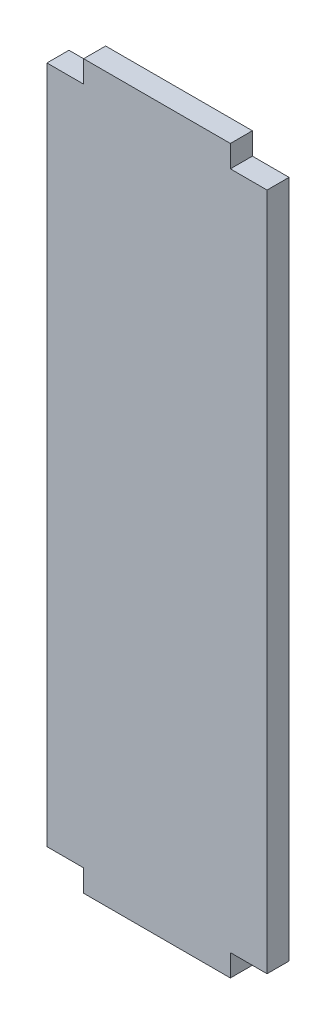
ISO-10303-21;
HEADER;
FILE_DESCRIPTION(('STEP AP214'),'2;1');
FILE_NAME('part.step','',(''),(''),'','','');
FILE_SCHEMA(('AUTOMOTIVE_DESIGN { 1 0 10303 214 1 1 1 1 }'));
ENDSEC;
DATA;
#1=APPLICATION_CONTEXT('core data for automotive mechanical design processes');
#2=APPLICATION_PROTOCOL_DEFINITION('international standard','automotive_design',2000,#1);
#3=PRODUCT_CONTEXT('',#1,'mechanical');
#4=PRODUCT('Part','Part','',(#3));
#5=PRODUCT_RELATED_PRODUCT_CATEGORY('part','',(#4));
#6=PRODUCT_DEFINITION_FORMATION('','',#4);
#7=PRODUCT_DEFINITION_CONTEXT('part definition',#1,'design');
#8=PRODUCT_DEFINITION('design','',#6,#7);
#9=PRODUCT_DEFINITION_SHAPE('','',#8);
#10=(LENGTH_UNIT() NAMED_UNIT(*) SI_UNIT(.MILLI.,.METRE.));
#11=(NAMED_UNIT(*) PLANE_ANGLE_UNIT() SI_UNIT($,.RADIAN.));
#12=(NAMED_UNIT(*) SI_UNIT($,.STERADIAN.) SOLID_ANGLE_UNIT());
#13=UNCERTAINTY_MEASURE_WITH_UNIT(LENGTH_MEASURE(1.E-05),#10,'distance_accuracy_value','');
#14=(GEOMETRIC_REPRESENTATION_CONTEXT(3) GLOBAL_UNCERTAINTY_ASSIGNED_CONTEXT((#13)) GLOBAL_UNIT_ASSIGNED_CONTEXT((#10,
#11,#12)) REPRESENTATION_CONTEXT('',''));
#15=CARTESIAN_POINT('',(0.,0.,0.));
#16=DIRECTION('',(0.,0.,1.));
#17=DIRECTION('',(1.,0.,0.));
#18=AXIS2_PLACEMENT_3D('',#15,#16,#17);
#19=CARTESIAN_POINT('',(-20.,92.5,6.));
#20=DIRECTION('',(0.,-1.,0.));
#21=DIRECTION('',(0.,0.,-1.));
#22=AXIS2_PLACEMENT_3D('',#19,#20,#21);
#23=PLANE('',#22);
#24=DIRECTION('',(-1.,0.,0.));
#25=VECTOR('',#24,1.);
#26=CARTESIAN_POINT('',(-20.,92.5,0.));
#27=LINE('',#26,#25);
#28=CARTESIAN_POINT('',(-20.,92.5,0.));
#29=VERTEX_POINT('',#28);
#30=CARTESIAN_POINT('',(-30.,92.5,0.));
#31=VERTEX_POINT('',#30);
#32=EDGE_CURVE('E153',#29,#31,#27,.T.);
#33=ORIENTED_EDGE('',*,*,#32,.T.);
#34=DIRECTION('',(0.,0.,-1.));
#35=VECTOR('',#34,1.);
#36=CARTESIAN_POINT('',(-30.,92.5,6.));
#37=LINE('',#36,#35);
#38=CARTESIAN_POINT('',(-30.,92.5,6.));
#39=VERTEX_POINT('',#38);
#40=EDGE_CURVE('E11',#39,#31,#37,.T.);
#41=ORIENTED_EDGE('',*,*,#40,.F.);
#42=DIRECTION('',(-1.,0.,0.));
#43=VECTOR('',#42,1.);
#44=CARTESIAN_POINT('',(-20.,92.5,6.));
#45=LINE('',#44,#43);
#46=CARTESIAN_POINT('',(-20.,92.5,6.));
#47=VERTEX_POINT('',#46);
#48=EDGE_CURVE('E175',#47,#39,#45,.T.);
#49=ORIENTED_EDGE('',*,*,#48,.F.);
#50=DIRECTION('',(0.,0.,-1.));
#51=VECTOR('',#50,1.);
#52=CARTESIAN_POINT('',(-20.,92.5,6.));
#53=LINE('',#52,#51);
#54=EDGE_CURVE('E149',#47,#29,#53,.T.);
#55=ORIENTED_EDGE('',*,*,#54,.T.);
#56=EDGE_LOOP('',(#33,#41,#49,#55));
#57=FACE_BOUND('',#56,.T.);
#58=ADVANCED_FACE('F33',(#57),#23,.F.);
#59=CARTESIAN_POINT('',(-30.,92.5,6.));
#60=DIRECTION('',(1.,0.,0.));
#61=DIRECTION('',(0.,0.,-1.));
#62=AXIS2_PLACEMENT_3D('',#59,#60,#61);
#63=PLANE('',#62);
#64=DIRECTION('',(0.,-1.,0.));
#65=VECTOR('',#64,1.);
#66=CARTESIAN_POINT('',(-30.,92.5,0.));
#67=LINE('',#66,#65);
#68=CARTESIAN_POINT('',(-30.,-92.5,0.));
#69=VERTEX_POINT('',#68);
#70=EDGE_CURVE('E156',#31,#69,#67,.T.);
#71=ORIENTED_EDGE('',*,*,#70,.T.);
#72=DIRECTION('',(0.,0.,-1.));
#73=VECTOR('',#72,1.);
#74=CARTESIAN_POINT('',(-30.,-92.5,6.));
#75=LINE('',#74,#73);
#76=CARTESIAN_POINT('',(-30.,-92.5,6.));
#77=VERTEX_POINT('',#76);
#78=EDGE_CURVE('E41',#77,#69,#75,.T.);
#79=ORIENTED_EDGE('',*,*,#78,.F.);
#80=DIRECTION('',(0.,-1.,0.));
#81=VECTOR('',#80,1.);
#82=CARTESIAN_POINT('',(-30.,92.5,6.));
#83=LINE('',#82,#81);
#84=EDGE_CURVE('E104',#39,#77,#83,.T.);
#85=ORIENTED_EDGE('',*,*,#84,.F.);
#86=ORIENTED_EDGE('',*,*,#40,.T.);
#87=EDGE_LOOP('',(#71,#79,#85,#86));
#88=FACE_BOUND('',#87,.T.);
#89=ADVANCED_FACE('F253',(#88),#63,.F.);
#90=CARTESIAN_POINT('',(-30.,-92.5,6.));
#91=DIRECTION('',(0.,1.,0.));
#92=DIRECTION('',(0.,0.,1.));
#93=AXIS2_PLACEMENT_3D('',#90,#91,#92);
#94=PLANE('',#93);
#95=DIRECTION('',(1.,0.,0.));
#96=VECTOR('',#95,1.);
#97=CARTESIAN_POINT('',(-30.,-92.5,0.));
#98=LINE('',#97,#96);
#99=CARTESIAN_POINT('',(-20.,-92.5,0.));
#100=VERTEX_POINT('',#99);
#101=EDGE_CURVE('E158',#69,#100,#98,.T.);
#102=ORIENTED_EDGE('',*,*,#101,.T.);
#103=DIRECTION('',(0.,0.,-1.));
#104=VECTOR('',#103,1.);
#105=CARTESIAN_POINT('',(-20.,-92.5,6.));
#106=LINE('',#105,#104);
#107=CARTESIAN_POINT('',(-20.,-92.5,6.));
#108=VERTEX_POINT('',#107);
#109=EDGE_CURVE('E194',#108,#100,#106,.T.);
#110=ORIENTED_EDGE('',*,*,#109,.F.);
#111=DIRECTION('',(1.,0.,0.));
#112=VECTOR('',#111,1.);
#113=CARTESIAN_POINT('',(-30.,-92.5,6.));
#114=LINE('',#113,#112);
#115=EDGE_CURVE('E202',#77,#108,#114,.T.);
#116=ORIENTED_EDGE('',*,*,#115,.F.);
#117=ORIENTED_EDGE('',*,*,#78,.T.);
#118=EDGE_LOOP('',(#102,#110,#116,#117));
#119=FACE_BOUND('',#118,.T.);
#120=ADVANCED_FACE('F200',(#119),#94,.F.);
#121=CARTESIAN_POINT('',(-20.,-92.5,6.));
#122=DIRECTION('',(1.,0.,0.));
#123=DIRECTION('',(0.,0.,-1.));
#124=AXIS2_PLACEMENT_3D('',#121,#122,#123);
#125=PLANE('',#124);
#126=DIRECTION('',(0.,-1.,0.));
#127=VECTOR('',#126,1.);
#128=CARTESIAN_POINT('',(-20.,-92.5,0.));
#129=LINE('',#128,#127);
#130=CARTESIAN_POINT('',(-20.,-98.5,0.));
#131=VERTEX_POINT('',#130);
#132=EDGE_CURVE('E160',#100,#131,#129,.T.);
#133=ORIENTED_EDGE('',*,*,#132,.T.);
#134=DIRECTION('',(0.,0.,-1.));
#135=VECTOR('',#134,1.);
#136=CARTESIAN_POINT('',(-20.,-98.5,6.));
#137=LINE('',#136,#135);
#138=CARTESIAN_POINT('',(-20.,-98.5,6.));
#139=VERTEX_POINT('',#138);
#140=EDGE_CURVE('E191',#139,#131,#137,.T.);
#141=ORIENTED_EDGE('',*,*,#140,.F.);
#142=DIRECTION('',(0.,-1.,0.));
#143=VECTOR('',#142,1.);
#144=CARTESIAN_POINT('',(-20.,-92.5,6.));
#145=LINE('',#144,#143);
#146=EDGE_CURVE('E220',#108,#139,#145,.T.);
#147=ORIENTED_EDGE('',*,*,#146,.F.);
#148=ORIENTED_EDGE('',*,*,#109,.T.);
#149=EDGE_LOOP('',(#133,#141,#147,#148));
#150=FACE_BOUND('',#149,.T.);
#151=ADVANCED_FACE('F211',(#150),#125,.F.);
#152=CARTESIAN_POINT('',(-20.,-98.5,6.));
#153=DIRECTION('',(0.,1.,0.));
#154=DIRECTION('',(0.,0.,1.));
#155=AXIS2_PLACEMENT_3D('',#152,#153,#154);
#156=PLANE('',#155);
#157=DIRECTION('',(1.,0.,0.));
#158=VECTOR('',#157,1.);
#159=CARTESIAN_POINT('',(-20.,-98.5,0.));
#160=LINE('',#159,#158);
#161=CARTESIAN_POINT('',(20.,-98.5,0.));
#162=VERTEX_POINT('',#161);
#163=EDGE_CURVE('E162',#131,#162,#160,.T.);
#164=ORIENTED_EDGE('',*,*,#163,.T.);
#165=DIRECTION('',(0.,0.,-1.));
#166=VECTOR('',#165,1.);
#167=CARTESIAN_POINT('',(20.,-98.5,6.));
#168=LINE('',#167,#166);
#169=CARTESIAN_POINT('',(20.,-98.5,6.));
#170=VERTEX_POINT('',#169);
#171=EDGE_CURVE('E188',#170,#162,#168,.T.);
#172=ORIENTED_EDGE('',*,*,#171,.F.);
#173=DIRECTION('',(1.,0.,0.));
#174=VECTOR('',#173,1.);
#175=CARTESIAN_POINT('',(-20.,-98.5,6.));
#176=LINE('',#175,#174);
#177=EDGE_CURVE('E217',#139,#170,#176,.T.);
#178=ORIENTED_EDGE('',*,*,#177,.F.);
#179=ORIENTED_EDGE('',*,*,#140,.T.);
#180=EDGE_LOOP('',(#164,#172,#178,#179));
#181=FACE_BOUND('',#180,.T.);
#182=ADVANCED_FACE('F215',(#181),#156,.F.);
#183=CARTESIAN_POINT('',(20.,-98.5,6.));
#184=DIRECTION('',(-1.,0.,0.));
#185=DIRECTION('',(0.,0.,1.));
#186=AXIS2_PLACEMENT_3D('',#183,#184,#185);
#187=PLANE('',#186);
#188=DIRECTION('',(0.,1.,0.));
#189=VECTOR('',#188,1.);
#190=CARTESIAN_POINT('',(20.,-98.5,0.));
#191=LINE('',#190,#189);
#192=CARTESIAN_POINT('',(20.,-92.5,0.));
#193=VERTEX_POINT('',#192);
#194=EDGE_CURVE('E164',#162,#193,#191,.T.);
#195=ORIENTED_EDGE('',*,*,#194,.T.);
#196=DIRECTION('',(0.,0.,-1.));
#197=VECTOR('',#196,1.);
#198=CARTESIAN_POINT('',(20.,-92.5,6.));
#199=LINE('',#198,#197);
#200=CARTESIAN_POINT('',(20.,-92.5,6.));
#201=VERTEX_POINT('',#200);
#202=EDGE_CURVE('E185',#201,#193,#199,.T.);
#203=ORIENTED_EDGE('',*,*,#202,.F.);
#204=DIRECTION('',(0.,1.,0.));
#205=VECTOR('',#204,1.);
#206=CARTESIAN_POINT('',(20.,-98.5,6.));
#207=LINE('',#206,#205);
#208=EDGE_CURVE('E219',#170,#201,#207,.T.);
#209=ORIENTED_EDGE('',*,*,#208,.F.);
#210=ORIENTED_EDGE('',*,*,#171,.T.);
#211=EDGE_LOOP('',(#195,#203,#209,#210));
#212=FACE_BOUND('',#211,.T.);
#213=ADVANCED_FACE('F266',(#212),#187,.F.);
#214=CARTESIAN_POINT('',(20.,-92.5,6.));
#215=DIRECTION('',(0.,1.,0.));
#216=DIRECTION('',(0.,0.,1.));
#217=AXIS2_PLACEMENT_3D('',#214,#215,#216);
#218=PLANE('',#217);
#219=DIRECTION('',(1.,0.,0.));
#220=VECTOR('',#219,1.);
#221=CARTESIAN_POINT('',(20.,-92.5,0.));
#222=LINE('',#221,#220);
#223=CARTESIAN_POINT('',(30.,-92.5,0.));
#224=VERTEX_POINT('',#223);
#225=EDGE_CURVE('E166',#193,#224,#222,.T.);
#226=ORIENTED_EDGE('',*,*,#225,.T.);
#227=DIRECTION('',(0.,0.,-1.));
#228=VECTOR('',#227,1.);
#229=CARTESIAN_POINT('',(30.,-92.5,6.));
#230=LINE('',#229,#228);
#231=CARTESIAN_POINT('',(30.,-92.5,6.));
#232=VERTEX_POINT('',#231);
#233=EDGE_CURVE('E182',#232,#224,#230,.T.);
#234=ORIENTED_EDGE('',*,*,#233,.F.);
#235=DIRECTION('',(1.,0.,0.));
#236=VECTOR('',#235,1.);
#237=CARTESIAN_POINT('',(20.,-92.5,6.));
#238=LINE('',#237,#236);
#239=EDGE_CURVE('E222',#201,#232,#238,.T.);
#240=ORIENTED_EDGE('',*,*,#239,.F.);
#241=ORIENTED_EDGE('',*,*,#202,.T.);
#242=EDGE_LOOP('',(#226,#234,#240,#241));
#243=FACE_BOUND('',#242,.T.);
#244=ADVANCED_FACE('F269',(#243),#218,.F.);
#245=CARTESIAN_POINT('',(30.,-92.5,6.));
#246=DIRECTION('',(-1.,0.,0.));
#247=DIRECTION('',(0.,0.,1.));
#248=AXIS2_PLACEMENT_3D('',#245,#246,#247);
#249=PLANE('',#248);
#250=DIRECTION('',(0.,1.,0.));
#251=VECTOR('',#250,1.);
#252=CARTESIAN_POINT('',(30.,-92.5,0.));
#253=LINE('',#252,#251);
#254=CARTESIAN_POINT('',(30.,92.5,0.));
#255=VERTEX_POINT('',#254);
#256=EDGE_CURVE('E168',#224,#255,#253,.T.);
#257=ORIENTED_EDGE('',*,*,#256,.T.);
#258=DIRECTION('',(0.,0.,-1.));
#259=VECTOR('',#258,1.);
#260=CARTESIAN_POINT('',(30.,92.5,6.));
#261=LINE('',#260,#259);
#262=CARTESIAN_POINT('',(30.,92.5,6.));
#263=VERTEX_POINT('',#262);
#264=EDGE_CURVE('E179',#263,#255,#261,.T.);
#265=ORIENTED_EDGE('',*,*,#264,.F.);
#266=DIRECTION('',(0.,1.,0.));
#267=VECTOR('',#266,1.);
#268=CARTESIAN_POINT('',(30.,-92.5,6.));
#269=LINE('',#268,#267);
#270=EDGE_CURVE('E228',#232,#263,#269,.T.);
#271=ORIENTED_EDGE('',*,*,#270,.F.);
#272=ORIENTED_EDGE('',*,*,#233,.T.);
#273=EDGE_LOOP('',(#257,#265,#271,#272));
#274=FACE_BOUND('',#273,.T.);
#275=ADVANCED_FACE('F234',(#274),#249,.F.);
#276=CARTESIAN_POINT('',(30.,92.5,6.));
#277=DIRECTION('',(0.,-1.,0.));
#278=DIRECTION('',(0.,0.,-1.));
#279=AXIS2_PLACEMENT_3D('',#276,#277,#278);
#280=PLANE('',#279);
#281=DIRECTION('',(-1.,0.,0.));
#282=VECTOR('',#281,1.);
#283=CARTESIAN_POINT('',(30.,92.5,0.));
#284=LINE('',#283,#282);
#285=CARTESIAN_POINT('',(20.,92.5,0.));
#286=VERTEX_POINT('',#285);
#287=EDGE_CURVE('E170',#255,#286,#284,.T.);
#288=ORIENTED_EDGE('',*,*,#287,.T.);
#289=DIRECTION('',(0.,0.,-1.));
#290=VECTOR('',#289,1.);
#291=CARTESIAN_POINT('',(20.,92.5,6.));
#292=LINE('',#291,#290);
#293=CARTESIAN_POINT('',(20.,92.5,6.));
#294=VERTEX_POINT('',#293);
#295=EDGE_CURVE('E144',#294,#286,#292,.T.);
#296=ORIENTED_EDGE('',*,*,#295,.F.);
#297=DIRECTION('',(-1.,0.,0.));
#298=VECTOR('',#297,1.);
#299=CARTESIAN_POINT('',(30.,92.5,6.));
#300=LINE('',#299,#298);
#301=EDGE_CURVE('E135',#263,#294,#300,.T.);
#302=ORIENTED_EDGE('',*,*,#301,.F.);
#303=ORIENTED_EDGE('',*,*,#264,.T.);
#304=EDGE_LOOP('',(#288,#296,#302,#303));
#305=FACE_BOUND('',#304,.T.);
#306=ADVANCED_FACE('F238',(#305),#280,.F.);
#307=CARTESIAN_POINT('',(20.,92.5,6.));
#308=DIRECTION('',(-1.,0.,0.));
#309=DIRECTION('',(0.,0.,1.));
#310=AXIS2_PLACEMENT_3D('',#307,#308,#309);
#311=PLANE('',#310);
#312=DIRECTION('',(0.,1.,0.));
#313=VECTOR('',#312,1.);
#314=CARTESIAN_POINT('',(20.,92.5,0.));
#315=LINE('',#314,#313);
#316=CARTESIAN_POINT('',(20.,98.5,0.));
#317=VERTEX_POINT('',#316);
#318=EDGE_CURVE('E143',#286,#317,#315,.T.);
#319=ORIENTED_EDGE('',*,*,#318,.T.);
#320=DIRECTION('',(0.,0.,-1.));
#321=VECTOR('',#320,1.);
#322=CARTESIAN_POINT('',(20.,98.5,6.));
#323=LINE('',#322,#321);
#324=CARTESIAN_POINT('',(20.,98.5,6.));
#325=VERTEX_POINT('',#324);
#326=EDGE_CURVE('E140',#325,#317,#323,.T.);
#327=ORIENTED_EDGE('',*,*,#326,.F.);
#328=DIRECTION('',(0.,1.,0.));
#329=VECTOR('',#328,1.);
#330=CARTESIAN_POINT('',(20.,92.5,6.));
#331=LINE('',#330,#329);
#332=EDGE_CURVE('E129',#294,#325,#331,.T.);
#333=ORIENTED_EDGE('',*,*,#332,.F.);
#334=ORIENTED_EDGE('',*,*,#295,.T.);
#335=EDGE_LOOP('',(#319,#327,#333,#334));
#336=FACE_BOUND('',#335,.T.);
#337=ADVANCED_FACE('F141',(#336),#311,.F.);
#338=CARTESIAN_POINT('',(20.,98.5,6.));
#339=DIRECTION('',(0.,-1.,0.));
#340=DIRECTION('',(0.,0.,-1.));
#341=AXIS2_PLACEMENT_3D('',#338,#339,#340);
#342=PLANE('',#341);
#343=DIRECTION('',(-1.,0.,0.));
#344=VECTOR('',#343,1.);
#345=CARTESIAN_POINT('',(20.,98.5,0.));
#346=LINE('',#345,#344);
#347=CARTESIAN_POINT('',(-20.,98.5,0.));
#348=VERTEX_POINT('',#347);
#349=EDGE_CURVE('E90',#317,#348,#346,.T.);
#350=ORIENTED_EDGE('',*,*,#349,.T.);
#351=DIRECTION('',(0.,0.,-1.));
#352=VECTOR('',#351,1.);
#353=CARTESIAN_POINT('',(-20.,98.5,6.));
#354=LINE('',#353,#352);
#355=CARTESIAN_POINT('',(-20.,98.5,6.));
#356=VERTEX_POINT('',#355);
#357=EDGE_CURVE('E145',#356,#348,#354,.T.);
#358=ORIENTED_EDGE('',*,*,#357,.F.);
#359=DIRECTION('',(-1.,0.,0.));
#360=VECTOR('',#359,1.);
#361=CARTESIAN_POINT('',(20.,98.5,6.));
#362=LINE('',#361,#360);
#363=EDGE_CURVE('E133',#325,#356,#362,.T.);
#364=ORIENTED_EDGE('',*,*,#363,.F.);
#365=ORIENTED_EDGE('',*,*,#326,.T.);
#366=EDGE_LOOP('',(#350,#358,#364,#365));
#367=FACE_BOUND('',#366,.T.);
#368=ADVANCED_FACE('F147',(#367),#342,.F.);
#369=CARTESIAN_POINT('',(-20.,98.5,6.));
#370=DIRECTION('',(1.,0.,0.));
#371=DIRECTION('',(0.,0.,-1.));
#372=AXIS2_PLACEMENT_3D('',#369,#370,#371);
#373=PLANE('',#372);
#374=DIRECTION('',(0.,-1.,0.));
#375=VECTOR('',#374,1.);
#376=CARTESIAN_POINT('',(-20.,98.5,0.));
#377=LINE('',#376,#375);
#378=EDGE_CURVE('E96',#348,#29,#377,.T.);
#379=ORIENTED_EDGE('',*,*,#378,.T.);
#380=ORIENTED_EDGE('',*,*,#54,.F.);
#381=DIRECTION('',(0.,-1.,0.));
#382=VECTOR('',#381,1.);
#383=CARTESIAN_POINT('',(-20.,98.5,6.));
#384=LINE('',#383,#382);
#385=EDGE_CURVE('E49',#356,#47,#384,.T.);
#386=ORIENTED_EDGE('',*,*,#385,.F.);
#387=ORIENTED_EDGE('',*,*,#357,.T.);
#388=EDGE_LOOP('',(#379,#380,#386,#387));
#389=FACE_BOUND('',#388,.T.);
#390=ADVANCED_FACE('F242',(#389),#373,.F.);
#391=CARTESIAN_POINT('',(0.,0.,6.));
#392=DIRECTION('',(0.,0.,1.));
#393=DIRECTION('',(1.,0.,0.));
#394=AXIS2_PLACEMENT_3D('',#391,#392,#393);
#395=PLANE('',#394);
#396=ORIENTED_EDGE('',*,*,#48,.T.);
#397=ORIENTED_EDGE('',*,*,#84,.T.);
#398=ORIENTED_EDGE('',*,*,#115,.T.);
#399=ORIENTED_EDGE('',*,*,#146,.T.);
#400=ORIENTED_EDGE('',*,*,#177,.T.);
#401=ORIENTED_EDGE('',*,*,#208,.T.);
#402=ORIENTED_EDGE('',*,*,#239,.T.);
#403=ORIENTED_EDGE('',*,*,#270,.T.);
#404=ORIENTED_EDGE('',*,*,#301,.T.);
#405=ORIENTED_EDGE('',*,*,#332,.T.);
#406=ORIENTED_EDGE('',*,*,#363,.T.);
#407=ORIENTED_EDGE('',*,*,#385,.T.);
#408=EDGE_LOOP('',(#396,#397,#398,#399,#400,#401,#402,#403,#404,#405,#406,#407));
#409=FACE_BOUND('',#408,.T.);
#410=ADVANCED_FACE('F131',(#409),#395,.T.);
#411=CARTESIAN_POINT('',(0.,0.,0.));
#412=DIRECTION('',(0.,0.,1.));
#413=DIRECTION('',(1.,0.,0.));
#414=AXIS2_PLACEMENT_3D('',#411,#412,#413);
#415=PLANE('',#414);
#416=ORIENTED_EDGE('',*,*,#32,.F.);
#417=ORIENTED_EDGE('',*,*,#378,.F.);
#418=ORIENTED_EDGE('',*,*,#349,.F.);
#419=ORIENTED_EDGE('',*,*,#318,.F.);
#420=ORIENTED_EDGE('',*,*,#287,.F.);
#421=ORIENTED_EDGE('',*,*,#256,.F.);
#422=ORIENTED_EDGE('',*,*,#225,.F.);
#423=ORIENTED_EDGE('',*,*,#194,.F.);
#424=ORIENTED_EDGE('',*,*,#163,.F.);
#425=ORIENTED_EDGE('',*,*,#132,.F.);
#426=ORIENTED_EDGE('',*,*,#101,.F.);
#427=ORIENTED_EDGE('',*,*,#70,.F.);
#428=EDGE_LOOP('',(#416,#417,#418,#419,#420,#421,#422,#423,#424,#425,#426,#427));
#429=FACE_BOUND('',#428,.T.);
#430=ADVANCED_FACE('F206',(#429),#415,.F.);
#431=CLOSED_SHELL('',(#58,#89,#120,#151,#182,#213,#244,#275,#306,#337,#368,#390,#410,#430));
#432=MANIFOLD_SOLID_BREP('B2',#431);
#433=ADVANCED_BREP_SHAPE_REPRESENTATION('',(#18,#432),#14);
#434=SHAPE_DEFINITION_REPRESENTATION(#9,#433);
ENDSEC;
END-ISO-10303-21;
